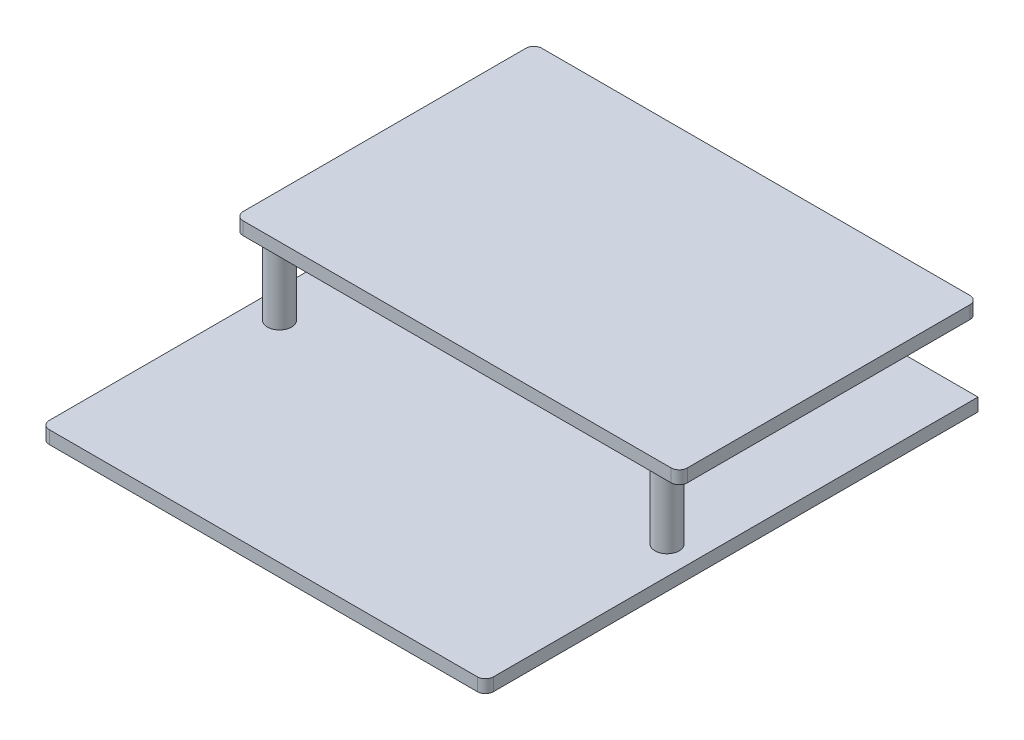
ISO-10303-21;
HEADER;
FILE_DESCRIPTION(('STEP AP214'),'2;1');
FILE_NAME('part.step','',(''),(''),'','','');
FILE_SCHEMA(('AUTOMOTIVE_DESIGN { 1 0 10303 214 1 1 1 1 }'));
ENDSEC;
DATA;
#1=APPLICATION_CONTEXT('core data for automotive mechanical design processes');
#2=APPLICATION_PROTOCOL_DEFINITION('international standard','automotive_design',2000,#1);
#3=PRODUCT_CONTEXT('',#1,'mechanical');
#4=PRODUCT('Part','Part','',(#3));
#5=PRODUCT_RELATED_PRODUCT_CATEGORY('part','',(#4));
#6=PRODUCT_DEFINITION_FORMATION('','',#4);
#7=PRODUCT_DEFINITION_CONTEXT('part definition',#1,'design');
#8=PRODUCT_DEFINITION('design','',#6,#7);
#9=PRODUCT_DEFINITION_SHAPE('','',#8);
#10=(LENGTH_UNIT() NAMED_UNIT(*) SI_UNIT(.MILLI.,.METRE.));
#11=(NAMED_UNIT(*) PLANE_ANGLE_UNIT() SI_UNIT($,.RADIAN.));
#12=(NAMED_UNIT(*) SI_UNIT($,.STERADIAN.) SOLID_ANGLE_UNIT());
#13=UNCERTAINTY_MEASURE_WITH_UNIT(LENGTH_MEASURE(1.E-05),#10,'distance_accuracy_value','');
#14=(GEOMETRIC_REPRESENTATION_CONTEXT(3) GLOBAL_UNCERTAINTY_ASSIGNED_CONTEXT((#13)) GLOBAL_UNIT_ASSIGNED_CONTEXT((#10,
#11,#12)) REPRESENTATION_CONTEXT('',''));
#15=CARTESIAN_POINT('',(0.,0.,0.));
#16=DIRECTION('',(0.,0.,1.));
#17=DIRECTION('',(1.,0.,0.));
#18=AXIS2_PLACEMENT_3D('',#15,#16,#17);
#19=CARTESIAN_POINT('',(-27.5,1.6,30.5));
#20=DIRECTION('',(1.,0.,0.));
#21=DIRECTION('',(0.,0.,-1.));
#22=AXIS2_PLACEMENT_3D('',#19,#20,#21);
#23=PLANE('',#22);
#24=DIRECTION('',(0.,0.,1.));
#25=VECTOR('',#24,1.);
#26=CARTESIAN_POINT('',(-27.5,0.,30.5));
#27=LINE('',#26,#25);
#28=CARTESIAN_POINT('',(-27.5,0.,-29.5));
#29=VERTEX_POINT('',#28);
#30=CARTESIAN_POINT('',(-27.5,0.,29.5));
#31=VERTEX_POINT('',#30);
#32=EDGE_CURVE('E177',#29,#31,#27,.T.);
#33=ORIENTED_EDGE('',*,*,#32,.T.);
#34=DIRECTION('',(0.,-1.,0.));
#35=VECTOR('',#34,1.);
#36=CARTESIAN_POINT('',(-27.5,1.6,29.5));
#37=LINE('',#36,#35);
#38=CARTESIAN_POINT('',(-27.5,1.6,29.5));
#39=VERTEX_POINT('',#38);
#40=EDGE_CURVE('E208',#31,#39,#37,.F.);
#41=ORIENTED_EDGE('',*,*,#40,.T.);
#42=DIRECTION('',(0.,0.,1.));
#43=VECTOR('',#42,1.);
#44=CARTESIAN_POINT('',(-27.5,1.6,30.5));
#45=LINE('',#44,#43);
#46=CARTESIAN_POINT('',(-27.5,1.6,-29.5));
#47=VERTEX_POINT('',#46);
#48=EDGE_CURVE('E186',#47,#39,#45,.T.);
#49=ORIENTED_EDGE('',*,*,#48,.F.);
#50=DIRECTION('',(0.,-1.,0.));
#51=VECTOR('',#50,1.);
#52=CARTESIAN_POINT('',(-27.5,1.6,-29.5));
#53=LINE('',#52,#51);
#54=EDGE_CURVE('E205',#47,#29,#53,.T.);
#55=ORIENTED_EDGE('',*,*,#54,.T.);
#56=EDGE_LOOP('',(#33,#41,#49,#55));
#57=FACE_BOUND('',#56,.T.);
#58=ADVANCED_FACE('F38',(#57),#23,.F.);
#59=CARTESIAN_POINT('',(27.5,1.6,30.5));
#60=DIRECTION('',(0.,0.,-1.));
#61=DIRECTION('',(-1.,0.,0.));
#62=AXIS2_PLACEMENT_3D('',#59,#60,#61);
#63=PLANE('',#62);
#64=DIRECTION('',(1.,0.,0.));
#65=VECTOR('',#64,1.);
#66=CARTESIAN_POINT('',(27.5,0.,30.5));
#67=LINE('',#66,#65);
#68=CARTESIAN_POINT('',(-26.5,0.,30.5));
#69=VERTEX_POINT('',#68);
#70=CARTESIAN_POINT('',(26.5,0.,30.5));
#71=VERTEX_POINT('',#70);
#72=EDGE_CURVE('E180',#69,#71,#67,.T.);
#73=ORIENTED_EDGE('',*,*,#72,.T.);
#74=DIRECTION('',(0.,-1.,0.));
#75=VECTOR('',#74,1.);
#76=CARTESIAN_POINT('',(26.5,1.6,30.5));
#77=LINE('',#76,#75);
#78=CARTESIAN_POINT('',(26.5,1.6,30.5));
#79=VERTEX_POINT('',#78);
#80=EDGE_CURVE('E198',#71,#79,#77,.F.);
#81=ORIENTED_EDGE('',*,*,#80,.T.);
#82=DIRECTION('',(1.,0.,0.));
#83=VECTOR('',#82,1.);
#84=CARTESIAN_POINT('',(27.5,1.6,30.5));
#85=LINE('',#84,#83);
#86=CARTESIAN_POINT('',(-26.5,1.6,30.5));
#87=VERTEX_POINT('',#86);
#88=EDGE_CURVE('E159',#87,#79,#85,.T.);
#89=ORIENTED_EDGE('',*,*,#88,.F.);
#90=DIRECTION('',(0.,-1.,0.));
#91=VECTOR('',#90,1.);
#92=CARTESIAN_POINT('',(-26.5,1.6,30.5));
#93=LINE('',#92,#91);
#94=EDGE_CURVE('E195',#87,#69,#93,.T.);
#95=ORIENTED_EDGE('',*,*,#94,.T.);
#96=EDGE_LOOP('',(#73,#81,#89,#95));
#97=FACE_BOUND('',#96,.T.);
#98=ADVANCED_FACE('F305',(#97),#63,.F.);
#99=CARTESIAN_POINT('',(27.5,1.6,30.5));
#100=DIRECTION('',(-1.,0.,0.));
#101=DIRECTION('',(0.,0.,1.));
#102=AXIS2_PLACEMENT_3D('',#99,#100,#101);
#103=PLANE('',#102);
#104=DIRECTION('',(0.,0.,-1.));
#105=VECTOR('',#104,1.);
#106=CARTESIAN_POINT('',(27.5,1.6,30.5));
#107=LINE('',#106,#105);
#108=CARTESIAN_POINT('',(27.5,1.6,29.5));
#109=VERTEX_POINT('',#108);
#110=CARTESIAN_POINT('',(27.5,1.6,-30.5));
#111=VERTEX_POINT('',#110);
#112=EDGE_CURVE('E147',#109,#111,#107,.T.);
#113=ORIENTED_EDGE('',*,*,#112,.F.);
#114=DIRECTION('',(0.,-1.,0.));
#115=VECTOR('',#114,1.);
#116=CARTESIAN_POINT('',(27.5,1.6,29.5));
#117=LINE('',#116,#115);
#118=CARTESIAN_POINT('',(27.5,0.,29.5));
#119=VERTEX_POINT('',#118);
#120=EDGE_CURVE('E169',#109,#119,#117,.T.);
#121=ORIENTED_EDGE('',*,*,#120,.T.);
#122=DIRECTION('',(0.,0.,-1.));
#123=VECTOR('',#122,1.);
#124=CARTESIAN_POINT('',(27.5,0.,30.5));
#125=LINE('',#124,#123);
#126=CARTESIAN_POINT('',(27.5,0.,-30.5));
#127=VERTEX_POINT('',#126);
#128=EDGE_CURVE('E165',#119,#127,#125,.T.);
#129=ORIENTED_EDGE('',*,*,#128,.T.);
#130=DIRECTION('',(0.,-1.,0.));
#131=VECTOR('',#130,1.);
#132=CARTESIAN_POINT('',(27.5,1.6,-30.5));
#133=LINE('',#132,#131);
#134=EDGE_CURVE('E162',#111,#127,#133,.T.);
#135=ORIENTED_EDGE('',*,*,#134,.F.);
#136=EDGE_LOOP('',(#113,#121,#129,#135));
#137=FACE_BOUND('',#136,.T.);
#138=ADVANCED_FACE('F163',(#137),#103,.F.);
#139=CARTESIAN_POINT('',(27.5,1.6,-30.5));
#140=DIRECTION('',(0.,0.,1.));
#141=DIRECTION('',(1.,0.,0.));
#142=AXIS2_PLACEMENT_3D('',#139,#140,#141);
#143=PLANE('',#142);
#144=DIRECTION('',(-1.,0.,0.));
#145=VECTOR('',#144,1.);
#146=CARTESIAN_POINT('',(27.5,0.,-30.5));
#147=LINE('',#146,#145);
#148=CARTESIAN_POINT('',(-26.5,0.,-30.5));
#149=VERTEX_POINT('',#148);
#150=EDGE_CURVE('E185',#127,#149,#147,.T.);
#151=ORIENTED_EDGE('',*,*,#150,.T.);
#152=DIRECTION('',(0.,-1.,0.));
#153=VECTOR('',#152,1.);
#154=CARTESIAN_POINT('',(-26.5,1.6,-30.5));
#155=LINE('',#154,#153);
#156=CARTESIAN_POINT('',(-26.5,1.6,-30.5));
#157=VERTEX_POINT('',#156);
#158=EDGE_CURVE('E173',#149,#157,#155,.F.);
#159=ORIENTED_EDGE('',*,*,#158,.T.);
#160=DIRECTION('',(-1.,0.,0.));
#161=VECTOR('',#160,1.);
#162=CARTESIAN_POINT('',(27.5,1.6,-30.5));
#163=LINE('',#162,#161);
#164=EDGE_CURVE('E152',#111,#157,#163,.T.);
#165=ORIENTED_EDGE('',*,*,#164,.F.);
#166=ORIENTED_EDGE('',*,*,#134,.T.);
#167=EDGE_LOOP('',(#151,#159,#165,#166));
#168=FACE_BOUND('',#167,.T.);
#169=ADVANCED_FACE('F171',(#168),#143,.F.);
#170=CARTESIAN_POINT('',(0.,1.6,0.));
#171=DIRECTION('',(0.,1.,0.));
#172=DIRECTION('',(0.,0.,1.));
#173=AXIS2_PLACEMENT_3D('',#170,#171,#172);
#174=PLANE('',#173);
#175=CARTESIAN_POINT('',(24.,1.6,4.5));
#176=DIRECTION('',(0.,1.,0.));
#177=DIRECTION('',(0.,0.,1.));
#178=AXIS2_PLACEMENT_3D('',#175,#176,#177);
#179=CIRCLE('',#178,1.5);
#180=CARTESIAN_POINT('',(24.,1.6,6.));
#181=VERTEX_POINT('',#180);
#182=EDGE_CURVE('E273',#181,#181,#179,.T.);
#183=ORIENTED_EDGE('',*,*,#182,.F.);
#184=EDGE_LOOP('',(#183));
#185=FACE_BOUND('',#184,.T.);
#186=CARTESIAN_POINT('',(-24.,1.6,4.5));
#187=DIRECTION('',(0.,1.,0.));
#188=DIRECTION('',(0.,0.,1.));
#189=AXIS2_PLACEMENT_3D('',#186,#187,#188);
#190=CIRCLE('',#189,1.5);
#191=CARTESIAN_POINT('',(-24.,1.6,6.));
#192=VERTEX_POINT('',#191);
#193=EDGE_CURVE('E276',#192,#192,#190,.T.);
#194=ORIENTED_EDGE('',*,*,#193,.F.);
#195=EDGE_LOOP('',(#194));
#196=FACE_BOUND('',#195,.T.);
#197=ORIENTED_EDGE('',*,*,#88,.T.);
#198=CARTESIAN_POINT('',(26.5,1.6,29.5));
#199=DIRECTION('',(0.,1.,0.));
#200=DIRECTION('',(0.,0.,1.));
#201=AXIS2_PLACEMENT_3D('',#198,#199,#200);
#202=CIRCLE('',#201,1.);
#203=EDGE_CURVE('E155',#79,#109,#202,.T.);
#204=ORIENTED_EDGE('',*,*,#203,.T.);
#205=ORIENTED_EDGE('',*,*,#112,.T.);
#206=ORIENTED_EDGE('',*,*,#164,.T.);
#207=CARTESIAN_POINT('',(-26.5,1.6,-29.5));
#208=DIRECTION('',(0.,1.,0.));
#209=DIRECTION('',(0.,0.,1.));
#210=AXIS2_PLACEMENT_3D('',#207,#208,#209);
#211=CIRCLE('',#210,1.);
#212=EDGE_CURVE('E200',#157,#47,#211,.T.);
#213=ORIENTED_EDGE('',*,*,#212,.T.);
#214=ORIENTED_EDGE('',*,*,#48,.T.);
#215=CARTESIAN_POINT('',(-26.5,1.6,29.5));
#216=DIRECTION('',(0.,1.,0.));
#217=DIRECTION('',(0.,0.,1.));
#218=AXIS2_PLACEMENT_3D('',#215,#216,#217);
#219=CIRCLE('',#218,1.);
#220=EDGE_CURVE('E202',#39,#87,#219,.T.);
#221=ORIENTED_EDGE('',*,*,#220,.T.);
#222=EDGE_LOOP('',(#197,#204,#205,#206,#213,#214,#221));
#223=FACE_BOUND('',#222,.T.);
#224=ADVANCED_FACE('F150',(#185,#196,#223),#174,.T.);
#225=CARTESIAN_POINT('',(0.,0.,0.));
#226=DIRECTION('',(0.,1.,0.));
#227=DIRECTION('',(0.,0.,1.));
#228=AXIS2_PLACEMENT_3D('',#225,#226,#227);
#229=PLANE('',#228);
#230=ORIENTED_EDGE('',*,*,#128,.F.);
#231=CARTESIAN_POINT('',(26.5,0.,29.5));
#232=DIRECTION('',(0.,1.,0.));
#233=DIRECTION('',(0.,0.,1.));
#234=AXIS2_PLACEMENT_3D('',#231,#232,#233);
#235=CIRCLE('',#234,1.);
#236=EDGE_CURVE('E193',#119,#71,#235,.F.);
#237=ORIENTED_EDGE('',*,*,#236,.T.);
#238=ORIENTED_EDGE('',*,*,#72,.F.);
#239=CARTESIAN_POINT('',(-26.5,0.,29.5));
#240=DIRECTION('',(0.,1.,0.));
#241=DIRECTION('',(0.,0.,1.));
#242=AXIS2_PLACEMENT_3D('',#239,#240,#241);
#243=CIRCLE('',#242,1.);
#244=EDGE_CURVE('E191',#69,#31,#243,.F.);
#245=ORIENTED_EDGE('',*,*,#244,.T.);
#246=ORIENTED_EDGE('',*,*,#32,.F.);
#247=CARTESIAN_POINT('',(-26.5,0.,-29.5));
#248=DIRECTION('',(0.,1.,0.));
#249=DIRECTION('',(0.,0.,1.));
#250=AXIS2_PLACEMENT_3D('',#247,#248,#249);
#251=CIRCLE('',#250,1.);
#252=EDGE_CURVE('E189',#29,#149,#251,.F.);
#253=ORIENTED_EDGE('',*,*,#252,.T.);
#254=ORIENTED_EDGE('',*,*,#150,.F.);
#255=EDGE_LOOP('',(#230,#237,#238,#245,#246,#253,#254));
#256=FACE_BOUND('',#255,.T.);
#257=ADVANCED_FACE('F294',(#256),#229,.F.);
#258=CARTESIAN_POINT('',(-24.,10.4,4.5));
#259=DIRECTION('',(0.,-1.,0.));
#260=DIRECTION('',(0.,0.,-1.));
#261=AXIS2_PLACEMENT_3D('',#258,#259,#260);
#262=CYLINDRICAL_SURFACE('',#261,1.5);
#263=CARTESIAN_POINT('',(-24.,10.4,4.5));
#264=DIRECTION('',(0.,1.,0.));
#265=DIRECTION('',(0.,0.,1.));
#266=AXIS2_PLACEMENT_3D('',#263,#264,#265);
#267=CIRCLE('',#266,1.5);
#268=CARTESIAN_POINT('',(-24.,10.4,6.));
#269=VERTEX_POINT('',#268);
#270=EDGE_CURVE('E181',#269,#269,#267,.T.);
#271=ORIENTED_EDGE('',*,*,#270,.F.);
#272=EDGE_LOOP('',(#271));
#273=FACE_BOUND('',#272,.T.);
#274=ORIENTED_EDGE('',*,*,#193,.T.);
#275=EDGE_LOOP('',(#274));
#276=FACE_BOUND('',#275,.T.);
#277=ADVANCED_FACE('F365',(#273,#276),#262,.T.);
#278=CARTESIAN_POINT('',(24.,10.4,4.5));
#279=DIRECTION('',(0.,-1.,0.));
#280=DIRECTION('',(0.,0.,-1.));
#281=AXIS2_PLACEMENT_3D('',#278,#279,#280);
#282=CYLINDRICAL_SURFACE('',#281,1.5);
#283=CARTESIAN_POINT('',(24.,10.4,4.5));
#284=DIRECTION('',(0.,1.,0.));
#285=DIRECTION('',(0.,0.,1.));
#286=AXIS2_PLACEMENT_3D('',#283,#284,#285);
#287=CIRCLE('',#286,1.5);
#288=CARTESIAN_POINT('',(24.,10.4,6.));
#289=VERTEX_POINT('',#288);
#290=EDGE_CURVE('E277',#289,#289,#287,.T.);
#291=ORIENTED_EDGE('',*,*,#290,.F.);
#292=EDGE_LOOP('',(#291));
#293=FACE_BOUND('',#292,.T.);
#294=ORIENTED_EDGE('',*,*,#182,.T.);
#295=EDGE_LOOP('',(#294));
#296=FACE_BOUND('',#295,.T.);
#297=ADVANCED_FACE('F362',(#293,#296),#282,.T.);
#298=CARTESIAN_POINT('',(-27.5,12.,6.50000000000001));
#299=DIRECTION('',(1.,0.,0.));
#300=DIRECTION('',(0.,0.,-1.));
#301=AXIS2_PLACEMENT_3D('',#298,#299,#300);
#302=PLANE('',#301);
#303=DIRECTION('',(0.,0.,1.));
#304=VECTOR('',#303,1.);
#305=CARTESIAN_POINT('',(-27.5,12.,6.50000000000001));
#306=LINE('',#305,#304);
#307=CARTESIAN_POINT('',(-27.5,12.,-29.5));
#308=VERTEX_POINT('',#307);
#309=CARTESIAN_POINT('',(-27.5,12.,5.50000000000001));
#310=VERTEX_POINT('',#309);
#311=EDGE_CURVE('E244',#308,#310,#306,.T.);
#312=ORIENTED_EDGE('',*,*,#311,.F.);
#313=DIRECTION('',(0.,-1.,0.));
#314=VECTOR('',#313,1.);
#315=CARTESIAN_POINT('',(-27.5,12.,-29.5));
#316=LINE('',#315,#314);
#317=CARTESIAN_POINT('',(-27.5,10.4,-29.5));
#318=VERTEX_POINT('',#317);
#319=EDGE_CURVE('E11',#308,#318,#316,.T.);
#320=ORIENTED_EDGE('',*,*,#319,.T.);
#321=DIRECTION('',(0.,0.,1.));
#322=VECTOR('',#321,1.);
#323=CARTESIAN_POINT('',(-27.5,10.4,6.50000000000001));
#324=LINE('',#323,#322);
#325=CARTESIAN_POINT('',(-27.5,10.4,5.50000000000001));
#326=VERTEX_POINT('',#325);
#327=EDGE_CURVE('E247',#318,#326,#324,.T.);
#328=ORIENTED_EDGE('',*,*,#327,.T.);
#329=DIRECTION('',(0.,-1.,0.));
#330=VECTOR('',#329,1.);
#331=CARTESIAN_POINT('',(-27.5,12.,5.50000000000001));
#332=LINE('',#331,#330);
#333=EDGE_CURVE('E46',#326,#310,#332,.F.);
#334=ORIENTED_EDGE('',*,*,#333,.T.);
#335=EDGE_LOOP('',(#312,#320,#328,#334));
#336=FACE_BOUND('',#335,.T.);
#337=ADVANCED_FACE('F243',(#336),#302,.F.);
#338=CARTESIAN_POINT('',(27.5,12.,6.5));
#339=DIRECTION('',(0.,0.,-1.));
#340=DIRECTION('',(-1.,0.,0.));
#341=AXIS2_PLACEMENT_3D('',#338,#339,#340);
#342=PLANE('',#341);
#343=DIRECTION('',(1.,0.,0.));
#344=VECTOR('',#343,1.);
#345=CARTESIAN_POINT('',(27.5,10.4,6.5));
#346=LINE('',#345,#344);
#347=CARTESIAN_POINT('',(-26.5,10.4,6.50000000000001));
#348=VERTEX_POINT('',#347);
#349=CARTESIAN_POINT('',(26.5,10.4,6.5));
#350=VERTEX_POINT('',#349);
#351=EDGE_CURVE('E259',#348,#350,#346,.T.);
#352=ORIENTED_EDGE('',*,*,#351,.T.);
#353=DIRECTION('',(0.,-1.,0.));
#354=VECTOR('',#353,1.);
#355=CARTESIAN_POINT('',(26.5,12.,6.5));
#356=LINE('',#355,#354);
#357=CARTESIAN_POINT('',(26.5,12.,6.5));
#358=VERTEX_POINT('',#357);
#359=EDGE_CURVE('E53',#350,#358,#356,.F.);
#360=ORIENTED_EDGE('',*,*,#359,.T.);
#361=DIRECTION('',(1.,0.,0.));
#362=VECTOR('',#361,1.);
#363=CARTESIAN_POINT('',(27.5,12.,6.5));
#364=LINE('',#363,#362);
#365=CARTESIAN_POINT('',(-26.5,12.,6.50000000000001));
#366=VERTEX_POINT('',#365);
#367=EDGE_CURVE('E253',#366,#358,#364,.T.);
#368=ORIENTED_EDGE('',*,*,#367,.F.);
#369=DIRECTION('',(0.,-1.,0.));
#370=VECTOR('',#369,1.);
#371=CARTESIAN_POINT('',(-26.5,12.,6.50000000000001));
#372=LINE('',#371,#370);
#373=EDGE_CURVE('E235',#366,#348,#372,.T.);
#374=ORIENTED_EDGE('',*,*,#373,.T.);
#375=EDGE_LOOP('',(#352,#360,#368,#374));
#376=FACE_BOUND('',#375,.T.);
#377=ADVANCED_FACE('F258',(#376),#342,.F.);
#378=CARTESIAN_POINT('',(27.5,12.,6.5));
#379=DIRECTION('',(-1.,0.,0.));
#380=DIRECTION('',(0.,0.,1.));
#381=AXIS2_PLACEMENT_3D('',#378,#379,#380);
#382=PLANE('',#381);
#383=DIRECTION('',(0.,0.,-1.));
#384=VECTOR('',#383,1.);
#385=CARTESIAN_POINT('',(27.5,10.4,6.5));
#386=LINE('',#385,#384);
#387=CARTESIAN_POINT('',(27.5,10.4,5.5));
#388=VERTEX_POINT('',#387);
#389=CARTESIAN_POINT('',(27.5,10.4,-29.5));
#390=VERTEX_POINT('',#389);
#391=EDGE_CURVE('E264',#388,#390,#386,.T.);
#392=ORIENTED_EDGE('',*,*,#391,.T.);
#393=DIRECTION('',(0.,-1.,0.));
#394=VECTOR('',#393,1.);
#395=CARTESIAN_POINT('',(27.5,12.,-29.5));
#396=LINE('',#395,#394);
#397=CARTESIAN_POINT('',(27.5,12.,-29.5));
#398=VERTEX_POINT('',#397);
#399=EDGE_CURVE('E226',#390,#398,#396,.F.);
#400=ORIENTED_EDGE('',*,*,#399,.T.);
#401=DIRECTION('',(0.,0.,-1.));
#402=VECTOR('',#401,1.);
#403=CARTESIAN_POINT('',(27.5,12.,6.5));
#404=LINE('',#403,#402);
#405=CARTESIAN_POINT('',(27.5,12.,5.5));
#406=VERTEX_POINT('',#405);
#407=EDGE_CURVE('E346',#406,#398,#404,.T.);
#408=ORIENTED_EDGE('',*,*,#407,.F.);
#409=DIRECTION('',(0.,-1.,0.));
#410=VECTOR('',#409,1.);
#411=CARTESIAN_POINT('',(27.5,12.,5.5));
#412=LINE('',#411,#410);
#413=EDGE_CURVE('E223',#406,#388,#412,.T.);
#414=ORIENTED_EDGE('',*,*,#413,.T.);
#415=EDGE_LOOP('',(#392,#400,#408,#414));
#416=FACE_BOUND('',#415,.T.);
#417=ADVANCED_FACE('F343',(#416),#382,.F.);
#418=CARTESIAN_POINT('',(27.5,12.,-30.5));
#419=DIRECTION('',(0.,0.,1.));
#420=DIRECTION('',(1.,0.,0.));
#421=AXIS2_PLACEMENT_3D('',#418,#419,#420);
#422=PLANE('',#421);
#423=DIRECTION('',(-1.,0.,0.));
#424=VECTOR('',#423,1.);
#425=CARTESIAN_POINT('',(27.5,12.,-30.5));
#426=LINE('',#425,#424);
#427=CARTESIAN_POINT('',(26.5,12.,-30.5));
#428=VERTEX_POINT('',#427);
#429=CARTESIAN_POINT('',(-26.5,12.,-30.5));
#430=VERTEX_POINT('',#429);
#431=EDGE_CURVE('E280',#428,#430,#426,.T.);
#432=ORIENTED_EDGE('',*,*,#431,.F.);
#433=DIRECTION('',(0.,-1.,0.));
#434=VECTOR('',#433,1.);
#435=CARTESIAN_POINT('',(26.5,12.,-30.5));
#436=LINE('',#435,#434);
#437=CARTESIAN_POINT('',(26.5,10.4,-30.5));
#438=VERTEX_POINT('',#437);
#439=EDGE_CURVE('E212',#428,#438,#436,.T.);
#440=ORIENTED_EDGE('',*,*,#439,.T.);
#441=DIRECTION('',(-1.,0.,0.));
#442=VECTOR('',#441,1.);
#443=CARTESIAN_POINT('',(27.5,10.4,-30.5));
#444=LINE('',#443,#442);
#445=CARTESIAN_POINT('',(-26.5,10.4,-30.5));
#446=VERTEX_POINT('',#445);
#447=EDGE_CURVE('E254',#438,#446,#444,.T.);
#448=ORIENTED_EDGE('',*,*,#447,.T.);
#449=DIRECTION('',(0.,-1.,0.));
#450=VECTOR('',#449,1.);
#451=CARTESIAN_POINT('',(-26.5,12.,-30.5));
#452=LINE('',#451,#450);
#453=EDGE_CURVE('E210',#446,#430,#452,.F.);
#454=ORIENTED_EDGE('',*,*,#453,.T.);
#455=EDGE_LOOP('',(#432,#440,#448,#454));
#456=FACE_BOUND('',#455,.T.);
#457=ADVANCED_FACE('F338',(#456),#422,.F.);
#458=CARTESIAN_POINT('',(0.,12.,0.));
#459=DIRECTION('',(0.,1.,0.));
#460=DIRECTION('',(0.,0.,1.));
#461=AXIS2_PLACEMENT_3D('',#458,#459,#460);
#462=PLANE('',#461);
#463=ORIENTED_EDGE('',*,*,#407,.T.);
#464=CARTESIAN_POINT('',(26.5,12.,-29.5));
#465=DIRECTION('',(0.,1.,0.));
#466=DIRECTION('',(0.,0.,1.));
#467=AXIS2_PLACEMENT_3D('',#464,#465,#466);
#468=CIRCLE('',#467,1.);
#469=EDGE_CURVE('E233',#398,#428,#468,.T.);
#470=ORIENTED_EDGE('',*,*,#469,.T.);
#471=ORIENTED_EDGE('',*,*,#431,.T.);
#472=CARTESIAN_POINT('',(-26.5,12.,-29.5));
#473=DIRECTION('',(0.,1.,0.));
#474=DIRECTION('',(0.,0.,1.));
#475=AXIS2_PLACEMENT_3D('',#472,#473,#474);
#476=CIRCLE('',#475,1.);
#477=EDGE_CURVE('E229',#430,#308,#476,.T.);
#478=ORIENTED_EDGE('',*,*,#477,.T.);
#479=ORIENTED_EDGE('',*,*,#311,.T.);
#480=CARTESIAN_POINT('',(-26.5,12.,5.50000000000001));
#481=DIRECTION('',(0.,1.,0.));
#482=DIRECTION('',(0.,0.,1.));
#483=AXIS2_PLACEMENT_3D('',#480,#481,#482);
#484=CIRCLE('',#483,1.);
#485=EDGE_CURVE('E60',#310,#366,#484,.T.);
#486=ORIENTED_EDGE('',*,*,#485,.T.);
#487=ORIENTED_EDGE('',*,*,#367,.T.);
#488=CARTESIAN_POINT('',(26.5,12.,5.5));
#489=DIRECTION('',(0.,1.,0.));
#490=DIRECTION('',(0.,0.,1.));
#491=AXIS2_PLACEMENT_3D('',#488,#489,#490);
#492=CIRCLE('',#491,1.);
#493=EDGE_CURVE('E231',#358,#406,#492,.T.);
#494=ORIENTED_EDGE('',*,*,#493,.T.);
#495=EDGE_LOOP('',(#463,#470,#471,#478,#479,#486,#487,#494));
#496=FACE_BOUND('',#495,.T.);
#497=ADVANCED_FACE('F250',(#496),#462,.T.);
#498=CARTESIAN_POINT('',(0.,10.4,0.));
#499=DIRECTION('',(0.,1.,0.));
#500=DIRECTION('',(0.,0.,1.));
#501=AXIS2_PLACEMENT_3D('',#498,#499,#500);
#502=PLANE('',#501);
#503=ORIENTED_EDGE('',*,*,#270,.T.);
#504=EDGE_LOOP('',(#503));
#505=FACE_BOUND('',#504,.T.);
#506=ORIENTED_EDGE('',*,*,#290,.T.);
#507=EDGE_LOOP('',(#506));
#508=FACE_BOUND('',#507,.T.);
#509=ORIENTED_EDGE('',*,*,#447,.F.);
#510=CARTESIAN_POINT('',(26.5,10.4,-29.5));
#511=DIRECTION('',(0.,1.,0.));
#512=DIRECTION('',(0.,0.,1.));
#513=AXIS2_PLACEMENT_3D('',#510,#511,#512);
#514=CIRCLE('',#513,1.);
#515=EDGE_CURVE('E221',#438,#390,#514,.F.);
#516=ORIENTED_EDGE('',*,*,#515,.T.);
#517=ORIENTED_EDGE('',*,*,#391,.F.);
#518=CARTESIAN_POINT('',(26.5,10.4,5.5));
#519=DIRECTION('',(0.,1.,0.));
#520=DIRECTION('',(0.,0.,1.));
#521=AXIS2_PLACEMENT_3D('',#518,#519,#520);
#522=CIRCLE('',#521,1.);
#523=EDGE_CURVE('E219',#388,#350,#522,.F.);
#524=ORIENTED_EDGE('',*,*,#523,.T.);
#525=ORIENTED_EDGE('',*,*,#351,.F.);
#526=CARTESIAN_POINT('',(-26.5,10.4,5.50000000000001));
#527=DIRECTION('',(0.,1.,0.));
#528=DIRECTION('',(0.,0.,1.));
#529=AXIS2_PLACEMENT_3D('',#526,#527,#528);
#530=CIRCLE('',#529,1.);
#531=EDGE_CURVE('E215',#348,#326,#530,.F.);
#532=ORIENTED_EDGE('',*,*,#531,.T.);
#533=ORIENTED_EDGE('',*,*,#327,.F.);
#534=CARTESIAN_POINT('',(-26.5,10.4,-29.5));
#535=DIRECTION('',(0.,1.,0.));
#536=DIRECTION('',(0.,0.,1.));
#537=AXIS2_PLACEMENT_3D('',#534,#535,#536);
#538=CIRCLE('',#537,1.);
#539=EDGE_CURVE('E217',#318,#446,#538,.F.);
#540=ORIENTED_EDGE('',*,*,#539,.T.);
#541=EDGE_LOOP('',(#509,#516,#517,#524,#525,#532,#533,#540));
#542=FACE_BOUND('',#541,.T.);
#543=ADVANCED_FACE('F262',(#505,#508,#542),#502,.F.);
#544=CARTESIAN_POINT('',(26.5,1.6,29.5));
#545=DIRECTION('',(0.,-1.,0.));
#546=DIRECTION('',(0.,0.,-1.));
#547=AXIS2_PLACEMENT_3D('',#544,#545,#546);
#548=CYLINDRICAL_SURFACE('',#547,1.);
#549=ORIENTED_EDGE('',*,*,#203,.F.);
#550=ORIENTED_EDGE('',*,*,#80,.F.);
#551=ORIENTED_EDGE('',*,*,#236,.F.);
#552=ORIENTED_EDGE('',*,*,#120,.F.);
#553=EDGE_LOOP('',(#549,#550,#551,#552));
#554=FACE_BOUND('',#553,.T.);
#555=ADVANCED_FACE('F292',(#554),#548,.T.);
#556=CARTESIAN_POINT('',(-26.5,1.6,29.5));
#557=DIRECTION('',(0.,-1.,0.));
#558=DIRECTION('',(0.,0.,-1.));
#559=AXIS2_PLACEMENT_3D('',#556,#557,#558);
#560=CYLINDRICAL_SURFACE('',#559,1.);
#561=ORIENTED_EDGE('',*,*,#220,.F.);
#562=ORIENTED_EDGE('',*,*,#40,.F.);
#563=ORIENTED_EDGE('',*,*,#244,.F.);
#564=ORIENTED_EDGE('',*,*,#94,.F.);
#565=EDGE_LOOP('',(#561,#562,#563,#564));
#566=FACE_BOUND('',#565,.T.);
#567=ADVANCED_FACE('F304',(#566),#560,.T.);
#568=CARTESIAN_POINT('',(26.5,12.,-29.5));
#569=DIRECTION('',(0.,-1.,0.));
#570=DIRECTION('',(0.,0.,-1.));
#571=AXIS2_PLACEMENT_3D('',#568,#569,#570);
#572=CYLINDRICAL_SURFACE('',#571,1.);
#573=ORIENTED_EDGE('',*,*,#469,.F.);
#574=ORIENTED_EDGE('',*,*,#399,.F.);
#575=ORIENTED_EDGE('',*,*,#515,.F.);
#576=ORIENTED_EDGE('',*,*,#439,.F.);
#577=EDGE_LOOP('',(#573,#574,#575,#576));
#578=FACE_BOUND('',#577,.T.);
#579=ADVANCED_FACE('F320',(#578),#572,.T.);
#580=CARTESIAN_POINT('',(26.5,12.,5.5));
#581=DIRECTION('',(0.,-1.,0.));
#582=DIRECTION('',(0.,0.,-1.));
#583=AXIS2_PLACEMENT_3D('',#580,#581,#582);
#584=CYLINDRICAL_SURFACE('',#583,1.);
#585=ORIENTED_EDGE('',*,*,#493,.F.);
#586=ORIENTED_EDGE('',*,*,#359,.F.);
#587=ORIENTED_EDGE('',*,*,#523,.F.);
#588=ORIENTED_EDGE('',*,*,#413,.F.);
#589=EDGE_LOOP('',(#585,#586,#587,#588));
#590=FACE_BOUND('',#589,.T.);
#591=ADVANCED_FACE('F323',(#590),#584,.T.);
#592=CARTESIAN_POINT('',(-26.5,1.6,-29.5));
#593=DIRECTION('',(0.,-1.,0.));
#594=DIRECTION('',(0.,0.,-1.));
#595=AXIS2_PLACEMENT_3D('',#592,#593,#594);
#596=CYLINDRICAL_SURFACE('',#595,1.);
#597=ORIENTED_EDGE('',*,*,#212,.F.);
#598=ORIENTED_EDGE('',*,*,#158,.F.);
#599=ORIENTED_EDGE('',*,*,#252,.F.);
#600=ORIENTED_EDGE('',*,*,#54,.F.);
#601=EDGE_LOOP('',(#597,#598,#599,#600));
#602=FACE_BOUND('',#601,.T.);
#603=ADVANCED_FACE('F298',(#602),#596,.T.);
#604=CARTESIAN_POINT('',(-26.5,12.,-29.5));
#605=DIRECTION('',(0.,-1.,0.));
#606=DIRECTION('',(0.,0.,-1.));
#607=AXIS2_PLACEMENT_3D('',#604,#605,#606);
#608=CYLINDRICAL_SURFACE('',#607,1.);
#609=ORIENTED_EDGE('',*,*,#477,.F.);
#610=ORIENTED_EDGE('',*,*,#453,.F.);
#611=ORIENTED_EDGE('',*,*,#539,.F.);
#612=ORIENTED_EDGE('',*,*,#319,.F.);
#613=EDGE_LOOP('',(#609,#610,#611,#612));
#614=FACE_BOUND('',#613,.T.);
#615=ADVANCED_FACE('F329',(#614),#608,.T.);
#616=CARTESIAN_POINT('',(-26.5,12.,5.50000000000001));
#617=DIRECTION('',(0.,-1.,0.));
#618=DIRECTION('',(0.,0.,-1.));
#619=AXIS2_PLACEMENT_3D('',#616,#617,#618);
#620=CYLINDRICAL_SURFACE('',#619,1.);
#621=ORIENTED_EDGE('',*,*,#485,.F.);
#622=ORIENTED_EDGE('',*,*,#333,.F.);
#623=ORIENTED_EDGE('',*,*,#531,.F.);
#624=ORIENTED_EDGE('',*,*,#373,.F.);
#625=EDGE_LOOP('',(#621,#622,#623,#624));
#626=FACE_BOUND('',#625,.T.);
#627=ADVANCED_FACE('F40',(#626),#620,.T.);
#628=CLOSED_SHELL('',(#58,#98,#138,#169,#224,#257,#277,#297,#337,#377,#417,#457,#497,#543,#555,
#567,#579,#591,#603,#615,#627));
#629=MANIFOLD_SOLID_BREP('B2',#628);
#630=ADVANCED_BREP_SHAPE_REPRESENTATION('',(#18,#629),#14);
#631=SHAPE_DEFINITION_REPRESENTATION(#9,#630);
ENDSEC;
END-ISO-10303-21;
